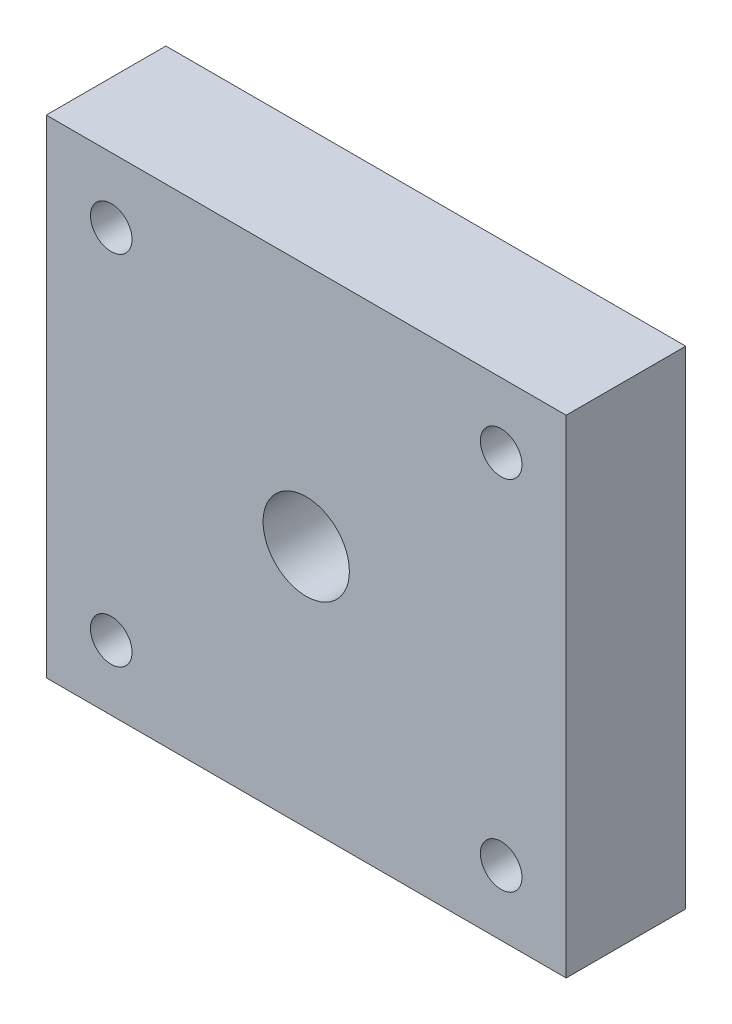
ISO-10303-21;
HEADER;
FILE_DESCRIPTION(('STEP AP214'),'2;1');
FILE_NAME('part.step','',(''),(''),'','','');
FILE_SCHEMA(('AUTOMOTIVE_DESIGN { 1 0 10303 214 1 1 1 1 }'));
ENDSEC;
DATA;
#1=APPLICATION_CONTEXT('core data for automotive mechanical design processes');
#2=APPLICATION_PROTOCOL_DEFINITION('international standard','automotive_design',2000,#1);
#3=PRODUCT_CONTEXT('',#1,'mechanical');
#4=PRODUCT('Part','Part','',(#3));
#5=PRODUCT_RELATED_PRODUCT_CATEGORY('part','',(#4));
#6=PRODUCT_DEFINITION_FORMATION('','',#4);
#7=PRODUCT_DEFINITION_CONTEXT('part definition',#1,'design');
#8=PRODUCT_DEFINITION('design','',#6,#7);
#9=PRODUCT_DEFINITION_SHAPE('','',#8);
#10=(LENGTH_UNIT() NAMED_UNIT(*) SI_UNIT(.MILLI.,.METRE.));
#11=(NAMED_UNIT(*) PLANE_ANGLE_UNIT() SI_UNIT($,.RADIAN.));
#12=(NAMED_UNIT(*) SI_UNIT($,.STERADIAN.) SOLID_ANGLE_UNIT());
#13=UNCERTAINTY_MEASURE_WITH_UNIT(LENGTH_MEASURE(1.E-05),#10,'distance_accuracy_value','');
#14=(GEOMETRIC_REPRESENTATION_CONTEXT(3) GLOBAL_UNCERTAINTY_ASSIGNED_CONTEXT((#13)) GLOBAL_UNIT_ASSIGNED_CONTEXT((#10,
#11,#12)) REPRESENTATION_CONTEXT('',''));
#15=CARTESIAN_POINT('',(0.,0.,0.));
#16=DIRECTION('',(0.,0.,1.));
#17=DIRECTION('',(1.,0.,0.));
#18=AXIS2_PLACEMENT_3D('',#15,#16,#17);
#19=CARTESIAN_POINT('',(0.,0.,11.684));
#20=DIRECTION('',(1.,0.,0.));
#21=DIRECTION('',(0.,1.,0.));
#22=AXIS2_PLACEMENT_3D('',#19,#20,#21);
#23=PLANE('',#22);
#24=DIRECTION('',(0.,-1.,0.));
#25=VECTOR('',#24,1.);
#26=CARTESIAN_POINT('',(0.,0.,0.));
#27=LINE('',#26,#25);
#28=CARTESIAN_POINT('',(0.,47.625,0.));
#29=VERTEX_POINT('',#28);
#30=CARTESIAN_POINT('',(0.,0.,0.));
#31=VERTEX_POINT('',#30);
#32=EDGE_CURVE('E96',#29,#31,#27,.T.);
#33=ORIENTED_EDGE('',*,*,#32,.T.);
#34=DIRECTION('',(0.,0.,-1.));
#35=VECTOR('',#34,1.);
#36=CARTESIAN_POINT('',(0.,0.,11.684));
#37=LINE('',#36,#35);
#38=CARTESIAN_POINT('',(0.,0.,11.684));
#39=VERTEX_POINT('',#38);
#40=EDGE_CURVE('E11',#39,#31,#37,.T.);
#41=ORIENTED_EDGE('',*,*,#40,.F.);
#42=DIRECTION('',(0.,-1.,0.));
#43=VECTOR('',#42,1.);
#44=CARTESIAN_POINT('',(0.,0.,11.684));
#45=LINE('',#44,#43);
#46=CARTESIAN_POINT('',(0.,47.625,11.684));
#47=VERTEX_POINT('',#46);
#48=EDGE_CURVE('E84',#47,#39,#45,.T.);
#49=ORIENTED_EDGE('',*,*,#48,.F.);
#50=DIRECTION('',(0.,0.,-1.));
#51=VECTOR('',#50,1.);
#52=CARTESIAN_POINT('',(0.,47.625,11.684));
#53=LINE('',#52,#51);
#54=EDGE_CURVE('E92',#47,#29,#53,.T.);
#55=ORIENTED_EDGE('',*,*,#54,.T.);
#56=EDGE_LOOP('',(#33,#41,#49,#55));
#57=FACE_BOUND('',#56,.T.);
#58=ADVANCED_FACE('F33',(#57),#23,.F.);
#59=CARTESIAN_POINT('',(0.,0.,11.684));
#60=DIRECTION('',(0.,1.,0.));
#61=DIRECTION('',(0.,0.,1.));
#62=AXIS2_PLACEMENT_3D('',#59,#60,#61);
#63=PLANE('',#62);
#64=DIRECTION('',(1.,0.,0.));
#65=VECTOR('',#64,1.);
#66=CARTESIAN_POINT('',(0.,0.,0.));
#67=LINE('',#66,#65);
#68=CARTESIAN_POINT('',(50.8,0.,0.));
#69=VERTEX_POINT('',#68);
#70=EDGE_CURVE('E88',#31,#69,#67,.T.);
#71=ORIENTED_EDGE('',*,*,#70,.T.);
#72=DIRECTION('',(0.,0.,-1.));
#73=VECTOR('',#72,1.);
#74=CARTESIAN_POINT('',(50.8,0.,11.684));
#75=LINE('',#74,#73);
#76=CARTESIAN_POINT('',(50.8,0.,11.684));
#77=VERTEX_POINT('',#76);
#78=EDGE_CURVE('E41',#77,#69,#75,.T.);
#79=ORIENTED_EDGE('',*,*,#78,.F.);
#80=DIRECTION('',(1.,0.,0.));
#81=VECTOR('',#80,1.);
#82=CARTESIAN_POINT('',(0.,0.,11.684));
#83=LINE('',#82,#81);
#84=EDGE_CURVE('E79',#39,#77,#83,.T.);
#85=ORIENTED_EDGE('',*,*,#84,.F.);
#86=ORIENTED_EDGE('',*,*,#40,.T.);
#87=EDGE_LOOP('',(#71,#79,#85,#86));
#88=FACE_BOUND('',#87,.T.);
#89=ADVANCED_FACE('F87',(#88),#63,.F.);
#90=CARTESIAN_POINT('',(50.8,0.,11.684));
#91=DIRECTION('',(-1.,0.,0.));
#92=DIRECTION('',(0.,-1.,0.));
#93=AXIS2_PLACEMENT_3D('',#90,#91,#92);
#94=PLANE('',#93);
#95=DIRECTION('',(0.,1.,0.));
#96=VECTOR('',#95,1.);
#97=CARTESIAN_POINT('',(50.8,0.,0.));
#98=LINE('',#97,#96);
#99=CARTESIAN_POINT('',(50.8,47.625,0.));
#100=VERTEX_POINT('',#99);
#101=EDGE_CURVE('E66',#69,#100,#98,.T.);
#102=ORIENTED_EDGE('',*,*,#101,.T.);
#103=DIRECTION('',(0.,0.,-1.));
#104=VECTOR('',#103,1.);
#105=CARTESIAN_POINT('',(50.8,47.625,11.684));
#106=LINE('',#105,#104);
#107=CARTESIAN_POINT('',(50.8,47.625,11.684));
#108=VERTEX_POINT('',#107);
#109=EDGE_CURVE('E89',#108,#100,#106,.T.);
#110=ORIENTED_EDGE('',*,*,#109,.F.);
#111=DIRECTION('',(0.,1.,0.));
#112=VECTOR('',#111,1.);
#113=CARTESIAN_POINT('',(50.8,0.,11.684));
#114=LINE('',#113,#112);
#115=EDGE_CURVE('E82',#77,#108,#114,.T.);
#116=ORIENTED_EDGE('',*,*,#115,.F.);
#117=ORIENTED_EDGE('',*,*,#78,.T.);
#118=EDGE_LOOP('',(#102,#110,#116,#117));
#119=FACE_BOUND('',#118,.T.);
#120=ADVANCED_FACE('F90',(#119),#94,.F.);
#121=CARTESIAN_POINT('',(0.,47.625,11.684));
#122=DIRECTION('',(0.,-1.,0.));
#123=DIRECTION('',(0.,0.,-1.));
#124=AXIS2_PLACEMENT_3D('',#121,#122,#123);
#125=PLANE('',#124);
#126=DIRECTION('',(-1.,0.,0.));
#127=VECTOR('',#126,1.);
#128=CARTESIAN_POINT('',(0.,47.625,0.));
#129=LINE('',#128,#127);
#130=EDGE_CURVE('E72',#100,#29,#129,.T.);
#131=ORIENTED_EDGE('',*,*,#130,.T.);
#132=ORIENTED_EDGE('',*,*,#54,.F.);
#133=DIRECTION('',(-1.,0.,0.));
#134=VECTOR('',#133,1.);
#135=CARTESIAN_POINT('',(0.,47.625,11.684));
#136=LINE('',#135,#134);
#137=EDGE_CURVE('E49',#108,#47,#136,.T.);
#138=ORIENTED_EDGE('',*,*,#137,.F.);
#139=ORIENTED_EDGE('',*,*,#109,.T.);
#140=EDGE_LOOP('',(#131,#132,#138,#139));
#141=FACE_BOUND('',#140,.T.);
#142=ADVANCED_FACE('F104',(#141),#125,.F.);
#143=CARTESIAN_POINT('',(0.,0.,11.684));
#144=DIRECTION('',(0.,0.,-1.));
#145=DIRECTION('',(-1.,0.,0.));
#146=AXIS2_PLACEMENT_3D('',#143,#144,#145);
#147=PLANE('',#146);
#148=CARTESIAN_POINT('',(6.34999999999999,6.35,11.684));
#149=DIRECTION('',(0.,0.,1.));
#150=DIRECTION('',(1.,0.,0.));
#151=AXIS2_PLACEMENT_3D('',#148,#149,#150);
#152=CIRCLE('',#151,2.032);
#153=CARTESIAN_POINT('',(8.38199999999999,6.35,11.684));
#154=VERTEX_POINT('',#153);
#155=EDGE_CURVE('E122',#154,#154,#152,.T.);
#156=ORIENTED_EDGE('',*,*,#155,.F.);
#157=EDGE_LOOP('',(#156));
#158=FACE_BOUND('',#157,.T.);
#159=CARTESIAN_POINT('',(44.45,6.35,11.684));
#160=DIRECTION('',(0.,0.,1.));
#161=DIRECTION('',(1.,0.,0.));
#162=AXIS2_PLACEMENT_3D('',#159,#160,#161);
#163=CIRCLE('',#162,2.032);
#164=CARTESIAN_POINT('',(46.482,6.35,11.684));
#165=VERTEX_POINT('',#164);
#166=EDGE_CURVE('E128',#165,#165,#163,.T.);
#167=ORIENTED_EDGE('',*,*,#166,.F.);
#168=EDGE_LOOP('',(#167));
#169=FACE_BOUND('',#168,.T.);
#170=CARTESIAN_POINT('',(44.45,41.275,11.684));
#171=DIRECTION('',(0.,0.,1.));
#172=DIRECTION('',(1.,0.,0.));
#173=AXIS2_PLACEMENT_3D('',#170,#171,#172);
#174=CIRCLE('',#173,2.032);
#175=CARTESIAN_POINT('',(46.482,41.275,11.684));
#176=VERTEX_POINT('',#175);
#177=EDGE_CURVE('E134',#176,#176,#174,.T.);
#178=ORIENTED_EDGE('',*,*,#177,.F.);
#179=EDGE_LOOP('',(#178));
#180=FACE_BOUND('',#179,.T.);
#181=CARTESIAN_POINT('',(6.34999999999999,41.275,11.684));
#182=DIRECTION('',(0.,0.,1.));
#183=DIRECTION('',(1.,0.,0.));
#184=AXIS2_PLACEMENT_3D('',#181,#182,#183);
#185=CIRCLE('',#184,2.032);
#186=CARTESIAN_POINT('',(8.38199999999999,41.275,11.684));
#187=VERTEX_POINT('',#186);
#188=EDGE_CURVE('E116',#187,#187,#185,.T.);
#189=ORIENTED_EDGE('',*,*,#188,.F.);
#190=EDGE_LOOP('',(#189));
#191=FACE_BOUND('',#190,.T.);
#192=CARTESIAN_POINT('',(25.4,23.8125,11.684));
#193=DIRECTION('',(0.,0.,1.));
#194=DIRECTION('',(1.,0.,0.));
#195=AXIS2_PLACEMENT_3D('',#192,#193,#194);
#196=CIRCLE('',#195,4.2164);
#197=CARTESIAN_POINT('',(29.6164,23.8125,11.684));
#198=VERTEX_POINT('',#197);
#199=EDGE_CURVE('E110',#198,#198,#196,.T.);
#200=ORIENTED_EDGE('',*,*,#199,.F.);
#201=EDGE_LOOP('',(#200));
#202=FACE_BOUND('',#201,.T.);
#203=ORIENTED_EDGE('',*,*,#48,.T.);
#204=ORIENTED_EDGE('',*,*,#84,.T.);
#205=ORIENTED_EDGE('',*,*,#115,.T.);
#206=ORIENTED_EDGE('',*,*,#137,.T.);
#207=EDGE_LOOP('',(#203,#204,#205,#206));
#208=FACE_BOUND('',#207,.T.);
#209=ADVANCED_FACE('F80',(#158,#169,#180,#191,#202,#208),#147,.F.);
#210=CARTESIAN_POINT('',(0.,0.,0.));
#211=DIRECTION('',(0.,0.,-1.));
#212=DIRECTION('',(-1.,0.,0.));
#213=AXIS2_PLACEMENT_3D('',#210,#211,#212);
#214=PLANE('',#213);
#215=CARTESIAN_POINT('',(6.34999999999999,6.35,0.));
#216=DIRECTION('',(0.,0.,1.));
#217=DIRECTION('',(1.,0.,0.));
#218=AXIS2_PLACEMENT_3D('',#215,#216,#217);
#219=CIRCLE('',#218,2.032);
#220=CARTESIAN_POINT('',(8.38199999999999,6.35,0.));
#221=VERTEX_POINT('',#220);
#222=EDGE_CURVE('E125',#221,#221,#219,.T.);
#223=ORIENTED_EDGE('',*,*,#222,.T.);
#224=EDGE_LOOP('',(#223));
#225=FACE_BOUND('',#224,.T.);
#226=CARTESIAN_POINT('',(44.45,6.35,0.));
#227=DIRECTION('',(0.,0.,1.));
#228=DIRECTION('',(1.,0.,0.));
#229=AXIS2_PLACEMENT_3D('',#226,#227,#228);
#230=CIRCLE('',#229,2.032);
#231=CARTESIAN_POINT('',(46.482,6.35,0.));
#232=VERTEX_POINT('',#231);
#233=EDGE_CURVE('E131',#232,#232,#230,.T.);
#234=ORIENTED_EDGE('',*,*,#233,.T.);
#235=EDGE_LOOP('',(#234));
#236=FACE_BOUND('',#235,.T.);
#237=CARTESIAN_POINT('',(44.45,41.275,0.));
#238=DIRECTION('',(0.,0.,1.));
#239=DIRECTION('',(1.,0.,0.));
#240=AXIS2_PLACEMENT_3D('',#237,#238,#239);
#241=CIRCLE('',#240,2.032);
#242=CARTESIAN_POINT('',(46.482,41.275,0.));
#243=VERTEX_POINT('',#242);
#244=EDGE_CURVE('E119',#243,#243,#241,.T.);
#245=ORIENTED_EDGE('',*,*,#244,.T.);
#246=EDGE_LOOP('',(#245));
#247=FACE_BOUND('',#246,.T.);
#248=CARTESIAN_POINT('',(6.34999999999999,41.275,0.));
#249=DIRECTION('',(0.,0.,1.));
#250=DIRECTION('',(1.,0.,0.));
#251=AXIS2_PLACEMENT_3D('',#248,#249,#250);
#252=CIRCLE('',#251,2.032);
#253=CARTESIAN_POINT('',(8.38199999999999,41.275,0.));
#254=VERTEX_POINT('',#253);
#255=EDGE_CURVE('E113',#254,#254,#252,.T.);
#256=ORIENTED_EDGE('',*,*,#255,.T.);
#257=EDGE_LOOP('',(#256));
#258=FACE_BOUND('',#257,.T.);
#259=CARTESIAN_POINT('',(25.4,23.8125,0.));
#260=DIRECTION('',(0.,0.,1.));
#261=DIRECTION('',(1.,0.,0.));
#262=AXIS2_PLACEMENT_3D('',#259,#260,#261);
#263=CIRCLE('',#262,4.2164);
#264=CARTESIAN_POINT('',(29.6164,23.8125,0.));
#265=VERTEX_POINT('',#264);
#266=EDGE_CURVE('E99',#265,#265,#263,.T.);
#267=ORIENTED_EDGE('',*,*,#266,.T.);
#268=EDGE_LOOP('',(#267));
#269=FACE_BOUND('',#268,.T.);
#270=ORIENTED_EDGE('',*,*,#32,.F.);
#271=ORIENTED_EDGE('',*,*,#130,.F.);
#272=ORIENTED_EDGE('',*,*,#101,.F.);
#273=ORIENTED_EDGE('',*,*,#70,.F.);
#274=EDGE_LOOP('',(#270,#271,#272,#273));
#275=FACE_BOUND('',#274,.T.);
#276=ADVANCED_FACE('F107',(#225,#236,#247,#258,#269,#275),#214,.T.);
#277=CARTESIAN_POINT('',(25.4,23.8125,0.));
#278=DIRECTION('',(0.,0.,1.));
#279=DIRECTION('',(1.,0.,0.));
#280=AXIS2_PLACEMENT_3D('',#277,#278,#279);
#281=CYLINDRICAL_SURFACE('',#280,4.2164);
#282=ORIENTED_EDGE('',*,*,#266,.F.);
#283=EDGE_LOOP('',(#282));
#284=FACE_BOUND('',#283,.T.);
#285=ORIENTED_EDGE('',*,*,#199,.T.);
#286=EDGE_LOOP('',(#285));
#287=FACE_BOUND('',#286,.T.);
#288=ADVANCED_FACE('F158',(#284,#287),#281,.F.);
#289=CARTESIAN_POINT('',(6.34999999999999,41.275,0.));
#290=DIRECTION('',(0.,0.,1.));
#291=DIRECTION('',(1.,0.,0.));
#292=AXIS2_PLACEMENT_3D('',#289,#290,#291);
#293=CYLINDRICAL_SURFACE('',#292,2.032);
#294=ORIENTED_EDGE('',*,*,#255,.F.);
#295=EDGE_LOOP('',(#294));
#296=FACE_BOUND('',#295,.T.);
#297=ORIENTED_EDGE('',*,*,#188,.T.);
#298=EDGE_LOOP('',(#297));
#299=FACE_BOUND('',#298,.T.);
#300=ADVANCED_FACE('F146',(#296,#299),#293,.F.);
#301=CARTESIAN_POINT('',(44.45,41.275,0.));
#302=DIRECTION('',(0.,0.,1.));
#303=DIRECTION('',(1.,0.,0.));
#304=AXIS2_PLACEMENT_3D('',#301,#302,#303);
#305=CYLINDRICAL_SURFACE('',#304,2.032);
#306=ORIENTED_EDGE('',*,*,#244,.F.);
#307=EDGE_LOOP('',(#306));
#308=FACE_BOUND('',#307,.T.);
#309=ORIENTED_EDGE('',*,*,#177,.T.);
#310=EDGE_LOOP('',(#309));
#311=FACE_BOUND('',#310,.T.);
#312=ADVANCED_FACE('F142',(#308,#311),#305,.F.);
#313=CARTESIAN_POINT('',(44.45,6.35,0.));
#314=DIRECTION('',(0.,0.,1.));
#315=DIRECTION('',(1.,0.,0.));
#316=AXIS2_PLACEMENT_3D('',#313,#314,#315);
#317=CYLINDRICAL_SURFACE('',#316,2.032);
#318=ORIENTED_EDGE('',*,*,#233,.F.);
#319=EDGE_LOOP('',(#318));
#320=FACE_BOUND('',#319,.T.);
#321=ORIENTED_EDGE('',*,*,#166,.T.);
#322=EDGE_LOOP('',(#321));
#323=FACE_BOUND('',#322,.T.);
#324=ADVANCED_FACE('F145',(#320,#323),#317,.F.);
#325=CARTESIAN_POINT('',(6.34999999999999,6.35,0.));
#326=DIRECTION('',(0.,0.,1.));
#327=DIRECTION('',(1.,0.,0.));
#328=AXIS2_PLACEMENT_3D('',#325,#326,#327);
#329=CYLINDRICAL_SURFACE('',#328,2.032);
#330=ORIENTED_EDGE('',*,*,#222,.F.);
#331=EDGE_LOOP('',(#330));
#332=FACE_BOUND('',#331,.T.);
#333=ORIENTED_EDGE('',*,*,#155,.T.);
#334=EDGE_LOOP('',(#333));
#335=FACE_BOUND('',#334,.T.);
#336=ADVANCED_FACE('F215',(#332,#335),#329,.F.);
#337=CLOSED_SHELL('',(#58,#89,#120,#142,#209,#276,#288,#300,#312,#324,#336));
#338=MANIFOLD_SOLID_BREP('B2',#337);
#339=ADVANCED_BREP_SHAPE_REPRESENTATION('',(#18,#338),#14);
#340=SHAPE_DEFINITION_REPRESENTATION(#9,#339);
ENDSEC;
END-ISO-10303-21;
